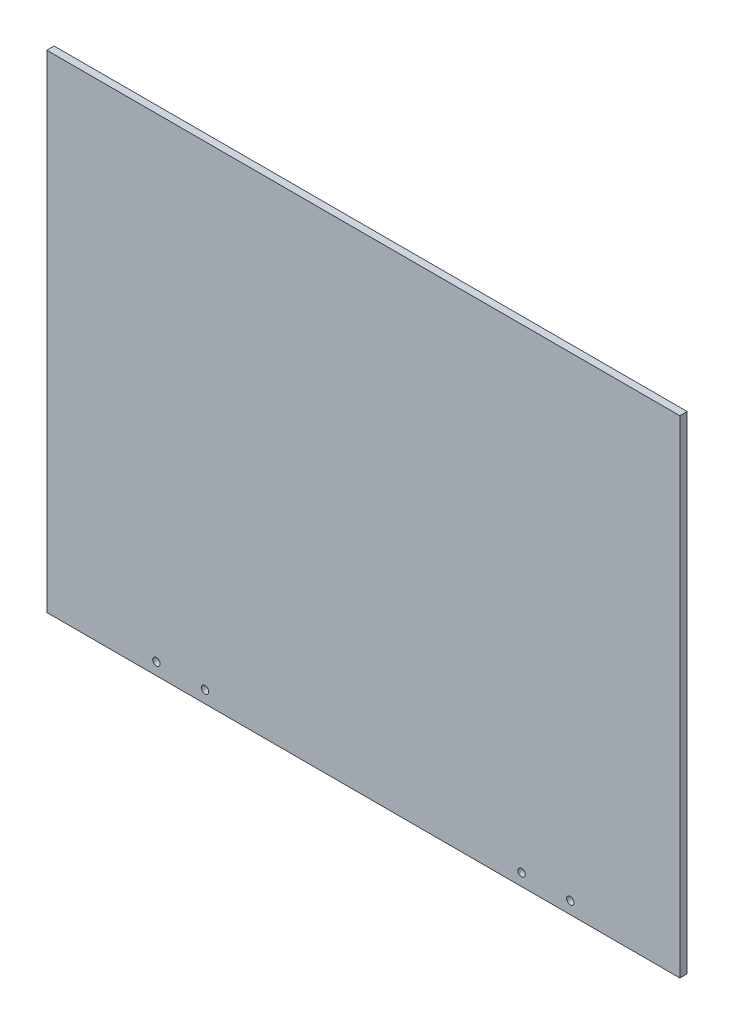
ISO-10303-21;
HEADER;
FILE_DESCRIPTION(('STEP AP214'),'2;1');
FILE_NAME('part.step','',(''),(''),'','','');
FILE_SCHEMA(('AUTOMOTIVE_DESIGN { 1 0 10303 214 1 1 1 1 }'));
ENDSEC;
DATA;
#1=APPLICATION_CONTEXT('core data for automotive mechanical design processes');
#2=APPLICATION_PROTOCOL_DEFINITION('international standard','automotive_design',2000,#1);
#3=PRODUCT_CONTEXT('',#1,'mechanical');
#4=PRODUCT('Part','Part','',(#3));
#5=PRODUCT_RELATED_PRODUCT_CATEGORY('part','',(#4));
#6=PRODUCT_DEFINITION_FORMATION('','',#4);
#7=PRODUCT_DEFINITION_CONTEXT('part definition',#1,'design');
#8=PRODUCT_DEFINITION('design','',#6,#7);
#9=PRODUCT_DEFINITION_SHAPE('','',#8);
#10=(LENGTH_UNIT() NAMED_UNIT(*) SI_UNIT(.MILLI.,.METRE.));
#11=(NAMED_UNIT(*) PLANE_ANGLE_UNIT() SI_UNIT($,.RADIAN.));
#12=(NAMED_UNIT(*) SI_UNIT($,.STERADIAN.) SOLID_ANGLE_UNIT());
#13=UNCERTAINTY_MEASURE_WITH_UNIT(LENGTH_MEASURE(1.E-05),#10,'distance_accuracy_value','');
#14=(GEOMETRIC_REPRESENTATION_CONTEXT(3) GLOBAL_UNCERTAINTY_ASSIGNED_CONTEXT((#13)) GLOBAL_UNIT_ASSIGNED_CONTEXT((#10,
#11,#12)) REPRESENTATION_CONTEXT('',''));
#15=CARTESIAN_POINT('',(0.,0.,0.));
#16=DIRECTION('',(0.,0.,1.));
#17=DIRECTION('',(1.,0.,0.));
#18=AXIS2_PLACEMENT_3D('',#15,#16,#17);
#19=CARTESIAN_POINT('',(130.,100.,3.));
#20=DIRECTION('',(-1.,0.,0.));
#21=DIRECTION('',(0.,-1.,0.));
#22=AXIS2_PLACEMENT_3D('',#19,#20,#21);
#23=PLANE('',#22);
#24=DIRECTION('',(0.,1.,0.));
#25=VECTOR('',#24,1.);
#26=CARTESIAN_POINT('',(130.,100.,0.));
#27=LINE('',#26,#25);
#28=CARTESIAN_POINT('',(130.,-100.,0.));
#29=VERTEX_POINT('',#28);
#30=CARTESIAN_POINT('',(130.,100.,0.));
#31=VERTEX_POINT('',#30);
#32=EDGE_CURVE('E107',#29,#31,#27,.T.);
#33=ORIENTED_EDGE('',*,*,#32,.T.);
#34=DIRECTION('',(0.,0.,-1.));
#35=VECTOR('',#34,1.);
#36=CARTESIAN_POINT('',(130.,100.,3.));
#37=LINE('',#36,#35);
#38=CARTESIAN_POINT('',(130.,100.,3.));
#39=VERTEX_POINT('',#38);
#40=EDGE_CURVE('E11',#39,#31,#37,.T.);
#41=ORIENTED_EDGE('',*,*,#40,.F.);
#42=DIRECTION('',(0.,1.,0.));
#43=VECTOR('',#42,1.);
#44=CARTESIAN_POINT('',(130.,100.,3.));
#45=LINE('',#44,#43);
#46=CARTESIAN_POINT('',(130.,-100.,3.));
#47=VERTEX_POINT('',#46);
#48=EDGE_CURVE('E91',#47,#39,#45,.T.);
#49=ORIENTED_EDGE('',*,*,#48,.F.);
#50=DIRECTION('',(0.,0.,-1.));
#51=VECTOR('',#50,1.);
#52=CARTESIAN_POINT('',(130.,-100.,3.));
#53=LINE('',#52,#51);
#54=EDGE_CURVE('E103',#47,#29,#53,.T.);
#55=ORIENTED_EDGE('',*,*,#54,.T.);
#56=EDGE_LOOP('',(#33,#41,#49,#55));
#57=FACE_BOUND('',#56,.T.);
#58=ADVANCED_FACE('F39',(#57),#23,.F.);
#59=CARTESIAN_POINT('',(-130.,100.,3.));
#60=DIRECTION('',(0.,-1.,0.));
#61=DIRECTION('',(0.,0.,-1.));
#62=AXIS2_PLACEMENT_3D('',#59,#60,#61);
#63=PLANE('',#62);
#64=DIRECTION('',(-1.,0.,0.));
#65=VECTOR('',#64,1.);
#66=CARTESIAN_POINT('',(-130.,100.,0.));
#67=LINE('',#66,#65);
#68=CARTESIAN_POINT('',(-130.,100.,0.));
#69=VERTEX_POINT('',#68);
#70=EDGE_CURVE('E96',#31,#69,#67,.T.);
#71=ORIENTED_EDGE('',*,*,#70,.T.);
#72=DIRECTION('',(0.,0.,-1.));
#73=VECTOR('',#72,1.);
#74=CARTESIAN_POINT('',(-130.,100.,3.));
#75=LINE('',#74,#73);
#76=CARTESIAN_POINT('',(-130.,100.,3.));
#77=VERTEX_POINT('',#76);
#78=EDGE_CURVE('E48',#77,#69,#75,.T.);
#79=ORIENTED_EDGE('',*,*,#78,.F.);
#80=DIRECTION('',(-1.,0.,0.));
#81=VECTOR('',#80,1.);
#82=CARTESIAN_POINT('',(-130.,100.,3.));
#83=LINE('',#82,#81);
#84=EDGE_CURVE('E86',#39,#77,#83,.T.);
#85=ORIENTED_EDGE('',*,*,#84,.F.);
#86=ORIENTED_EDGE('',*,*,#40,.T.);
#87=EDGE_LOOP('',(#71,#79,#85,#86));
#88=FACE_BOUND('',#87,.T.);
#89=ADVANCED_FACE('F95',(#88),#63,.F.);
#90=CARTESIAN_POINT('',(-130.,100.,3.));
#91=DIRECTION('',(1.,0.,0.));
#92=DIRECTION('',(0.,1.,0.));
#93=AXIS2_PLACEMENT_3D('',#90,#91,#92);
#94=PLANE('',#93);
#95=DIRECTION('',(0.,-1.,0.));
#96=VECTOR('',#95,1.);
#97=CARTESIAN_POINT('',(-130.,100.,0.));
#98=LINE('',#97,#96);
#99=CARTESIAN_POINT('',(-130.,-100.,0.));
#100=VERTEX_POINT('',#99);
#101=EDGE_CURVE('E73',#69,#100,#98,.T.);
#102=ORIENTED_EDGE('',*,*,#101,.T.);
#103=DIRECTION('',(0.,0.,-1.));
#104=VECTOR('',#103,1.);
#105=CARTESIAN_POINT('',(-130.,-100.,3.));
#106=LINE('',#105,#104);
#107=CARTESIAN_POINT('',(-130.,-100.,3.));
#108=VERTEX_POINT('',#107);
#109=EDGE_CURVE('E98',#108,#100,#106,.T.);
#110=ORIENTED_EDGE('',*,*,#109,.F.);
#111=DIRECTION('',(0.,-1.,0.));
#112=VECTOR('',#111,1.);
#113=CARTESIAN_POINT('',(-130.,100.,3.));
#114=LINE('',#113,#112);
#115=EDGE_CURVE('E89',#77,#108,#114,.T.);
#116=ORIENTED_EDGE('',*,*,#115,.F.);
#117=ORIENTED_EDGE('',*,*,#78,.T.);
#118=EDGE_LOOP('',(#102,#110,#116,#117));
#119=FACE_BOUND('',#118,.T.);
#120=ADVANCED_FACE('F99',(#119),#94,.F.);
#121=CARTESIAN_POINT('',(-130.,-100.,3.));
#122=DIRECTION('',(0.,1.,0.));
#123=DIRECTION('',(0.,0.,1.));
#124=AXIS2_PLACEMENT_3D('',#121,#122,#123);
#125=PLANE('',#124);
#126=DIRECTION('',(1.,0.,0.));
#127=VECTOR('',#126,1.);
#128=CARTESIAN_POINT('',(-130.,-100.,0.));
#129=LINE('',#128,#127);
#130=EDGE_CURVE('E79',#100,#29,#129,.T.);
#131=ORIENTED_EDGE('',*,*,#130,.T.);
#132=ORIENTED_EDGE('',*,*,#54,.F.);
#133=DIRECTION('',(1.,0.,0.));
#134=VECTOR('',#133,1.);
#135=CARTESIAN_POINT('',(-130.,-100.,3.));
#136=LINE('',#135,#134);
#137=EDGE_CURVE('E56',#108,#47,#136,.T.);
#138=ORIENTED_EDGE('',*,*,#137,.F.);
#139=ORIENTED_EDGE('',*,*,#109,.T.);
#140=EDGE_LOOP('',(#131,#132,#138,#139));
#141=FACE_BOUND('',#140,.T.);
#142=ADVANCED_FACE('F121',(#141),#125,.F.);
#143=CARTESIAN_POINT('',(0.,0.,3.));
#144=DIRECTION('',(0.,0.,1.));
#145=DIRECTION('',(1.,0.,0.));
#146=AXIS2_PLACEMENT_3D('',#143,#144,#145);
#147=PLANE('',#146);
#148=CARTESIAN_POINT('',(-85.,-95.,3.));
#149=DIRECTION('',(0.,0.,1.));
#150=DIRECTION('',(1.,0.,0.));
#151=AXIS2_PLACEMENT_3D('',#148,#149,#150);
#152=CIRCLE('',#151,1.5);
#153=CARTESIAN_POINT('',(-83.5,-95.,3.));
#154=VERTEX_POINT('',#153);
#155=EDGE_CURVE('E111',#154,#154,#152,.T.);
#156=ORIENTED_EDGE('',*,*,#155,.F.);
#157=EDGE_LOOP('',(#156));
#158=FACE_BOUND('',#157,.T.);
#159=CARTESIAN_POINT('',(85.,-94.999999999999,3.));
#160=DIRECTION('',(0.,0.,1.));
#161=DIRECTION('',(1.,0.,0.));
#162=AXIS2_PLACEMENT_3D('',#159,#160,#161);
#163=CIRCLE('',#162,1.49999999999999);
#164=CARTESIAN_POINT('',(86.5,-94.999999999999,3.));
#165=VERTEX_POINT('',#164);
#166=EDGE_CURVE('E131',#165,#165,#163,.T.);
#167=ORIENTED_EDGE('',*,*,#166,.F.);
#168=EDGE_LOOP('',(#167));
#169=FACE_BOUND('',#168,.T.);
#170=CARTESIAN_POINT('',(65.,-94.9999999999993,3.));
#171=DIRECTION('',(0.,0.,1.));
#172=DIRECTION('',(1.,0.,0.));
#173=AXIS2_PLACEMENT_3D('',#170,#171,#172);
#174=CIRCLE('',#173,1.49999999999999);
#175=CARTESIAN_POINT('',(66.5,-94.9999999999993,3.));
#176=VERTEX_POINT('',#175);
#177=EDGE_CURVE('E135',#176,#176,#174,.T.);
#178=ORIENTED_EDGE('',*,*,#177,.F.);
#179=EDGE_LOOP('',(#178));
#180=FACE_BOUND('',#179,.T.);
#181=CARTESIAN_POINT('',(-65.,-95.,3.));
#182=DIRECTION('',(0.,0.,1.));
#183=DIRECTION('',(1.,0.,0.));
#184=AXIS2_PLACEMENT_3D('',#181,#182,#183);
#185=CIRCLE('',#184,1.5);
#186=CARTESIAN_POINT('',(-63.5,-95.,3.));
#187=VERTEX_POINT('',#186);
#188=EDGE_CURVE('E139',#187,#187,#185,.T.);
#189=ORIENTED_EDGE('',*,*,#188,.F.);
#190=EDGE_LOOP('',(#189));
#191=FACE_BOUND('',#190,.T.);
#192=ORIENTED_EDGE('',*,*,#48,.T.);
#193=ORIENTED_EDGE('',*,*,#84,.T.);
#194=ORIENTED_EDGE('',*,*,#115,.T.);
#195=ORIENTED_EDGE('',*,*,#137,.T.);
#196=EDGE_LOOP('',(#192,#193,#194,#195));
#197=FACE_BOUND('',#196,.T.);
#198=ADVANCED_FACE('F87',(#158,#169,#180,#191,#197),#147,.T.);
#199=CARTESIAN_POINT('',(0.,0.,0.));
#200=DIRECTION('',(0.,0.,1.));
#201=DIRECTION('',(1.,0.,0.));
#202=AXIS2_PLACEMENT_3D('',#199,#200,#201);
#203=PLANE('',#202);
#204=CARTESIAN_POINT('',(-85.,-95.,0.));
#205=DIRECTION('',(0.,0.,1.));
#206=DIRECTION('',(1.,0.,0.));
#207=AXIS2_PLACEMENT_3D('',#204,#205,#206);
#208=CIRCLE('',#207,1.5);
#209=CARTESIAN_POINT('',(-83.5,-95.,0.));
#210=VERTEX_POINT('',#209);
#211=EDGE_CURVE('E147',#210,#210,#208,.T.);
#212=ORIENTED_EDGE('',*,*,#211,.T.);
#213=EDGE_LOOP('',(#212));
#214=FACE_BOUND('',#213,.T.);
#215=CARTESIAN_POINT('',(85.,-94.999999999999,0.));
#216=DIRECTION('',(0.,0.,1.));
#217=DIRECTION('',(-1.,0.,0.));
#218=AXIS2_PLACEMENT_3D('',#215,#216,#217);
#219=CIRCLE('',#218,1.49999999999999);
#220=CARTESIAN_POINT('',(83.5,-94.999999999999,0.));
#221=VERTEX_POINT('',#220);
#222=EDGE_CURVE('E148',#221,#221,#219,.T.);
#223=ORIENTED_EDGE('',*,*,#222,.T.);
#224=EDGE_LOOP('',(#223));
#225=FACE_BOUND('',#224,.T.);
#226=CARTESIAN_POINT('',(65.,-94.9999999999993,0.));
#227=DIRECTION('',(0.,0.,1.));
#228=DIRECTION('',(-1.,0.,0.));
#229=AXIS2_PLACEMENT_3D('',#226,#227,#228);
#230=CIRCLE('',#229,1.49999999999999);
#231=CARTESIAN_POINT('',(63.5,-94.9999999999993,0.));
#232=VERTEX_POINT('',#231);
#233=EDGE_CURVE('E152',#232,#232,#230,.T.);
#234=ORIENTED_EDGE('',*,*,#233,.T.);
#235=EDGE_LOOP('',(#234));
#236=FACE_BOUND('',#235,.T.);
#237=CARTESIAN_POINT('',(-65.,-95.,0.));
#238=DIRECTION('',(0.,0.,1.));
#239=DIRECTION('',(1.,0.,0.));
#240=AXIS2_PLACEMENT_3D('',#237,#238,#239);
#241=CIRCLE('',#240,1.5);
#242=CARTESIAN_POINT('',(-63.5,-95.,0.));
#243=VERTEX_POINT('',#242);
#244=EDGE_CURVE('E143',#243,#243,#241,.T.);
#245=ORIENTED_EDGE('',*,*,#244,.T.);
#246=EDGE_LOOP('',(#245));
#247=FACE_BOUND('',#246,.T.);
#248=ORIENTED_EDGE('',*,*,#32,.F.);
#249=ORIENTED_EDGE('',*,*,#130,.F.);
#250=ORIENTED_EDGE('',*,*,#101,.F.);
#251=ORIENTED_EDGE('',*,*,#70,.F.);
#252=EDGE_LOOP('',(#248,#249,#250,#251));
#253=FACE_BOUND('',#252,.T.);
#254=ADVANCED_FACE('F124',(#214,#225,#236,#247,#253),#203,.F.);
#255=CARTESIAN_POINT('',(-65.,-95.,0.));
#256=DIRECTION('',(0.,0.,1.));
#257=DIRECTION('',(1.,0.,0.));
#258=AXIS2_PLACEMENT_3D('',#255,#256,#257);
#259=CYLINDRICAL_SURFACE('',#258,1.5);
#260=ORIENTED_EDGE('',*,*,#188,.T.);
#261=EDGE_LOOP('',(#260));
#262=FACE_BOUND('',#261,.T.);
#263=ORIENTED_EDGE('',*,*,#244,.F.);
#264=EDGE_LOOP('',(#263));
#265=FACE_BOUND('',#264,.T.);
#266=ADVANCED_FACE('F165',(#262,#265),#259,.F.);
#267=CARTESIAN_POINT('',(65.,-94.9999999999993,0.));
#268=DIRECTION('',(0.,0.,1.));
#269=DIRECTION('',(1.,0.,0.));
#270=AXIS2_PLACEMENT_3D('',#267,#268,#269);
#271=CYLINDRICAL_SURFACE('',#270,1.49999999999999);
#272=ORIENTED_EDGE('',*,*,#177,.T.);
#273=EDGE_LOOP('',(#272));
#274=FACE_BOUND('',#273,.T.);
#275=ORIENTED_EDGE('',*,*,#233,.F.);
#276=EDGE_LOOP('',(#275));
#277=FACE_BOUND('',#276,.T.);
#278=ADVANCED_FACE('F162',(#274,#277),#271,.F.);
#279=CARTESIAN_POINT('',(85.,-94.999999999999,0.));
#280=DIRECTION('',(0.,0.,1.));
#281=DIRECTION('',(1.,0.,0.));
#282=AXIS2_PLACEMENT_3D('',#279,#280,#281);
#283=CYLINDRICAL_SURFACE('',#282,1.49999999999999);
#284=ORIENTED_EDGE('',*,*,#166,.T.);
#285=EDGE_LOOP('',(#284));
#286=FACE_BOUND('',#285,.T.);
#287=ORIENTED_EDGE('',*,*,#222,.F.);
#288=EDGE_LOOP('',(#287));
#289=FACE_BOUND('',#288,.T.);
#290=ADVANCED_FACE('F164',(#286,#289),#283,.F.);
#291=CARTESIAN_POINT('',(-85.,-95.,0.));
#292=DIRECTION('',(0.,0.,1.));
#293=DIRECTION('',(1.,0.,0.));
#294=AXIS2_PLACEMENT_3D('',#291,#292,#293);
#295=CYLINDRICAL_SURFACE('',#294,1.5);
#296=ORIENTED_EDGE('',*,*,#155,.T.);
#297=EDGE_LOOP('',(#296));
#298=FACE_BOUND('',#297,.T.);
#299=ORIENTED_EDGE('',*,*,#211,.F.);
#300=EDGE_LOOP('',(#299));
#301=FACE_BOUND('',#300,.T.);
#302=ADVANCED_FACE('F172',(#298,#301),#295,.F.);
#303=CLOSED_SHELL('',(#58,#89,#120,#142,#198,#254,#266,#278,#290,#302));
#304=MANIFOLD_SOLID_BREP('B2',#303);
#305=ADVANCED_BREP_SHAPE_REPRESENTATION('',(#18,#304),#14);
#306=SHAPE_DEFINITION_REPRESENTATION(#9,#305);
ENDSEC;
END-ISO-10303-21;
